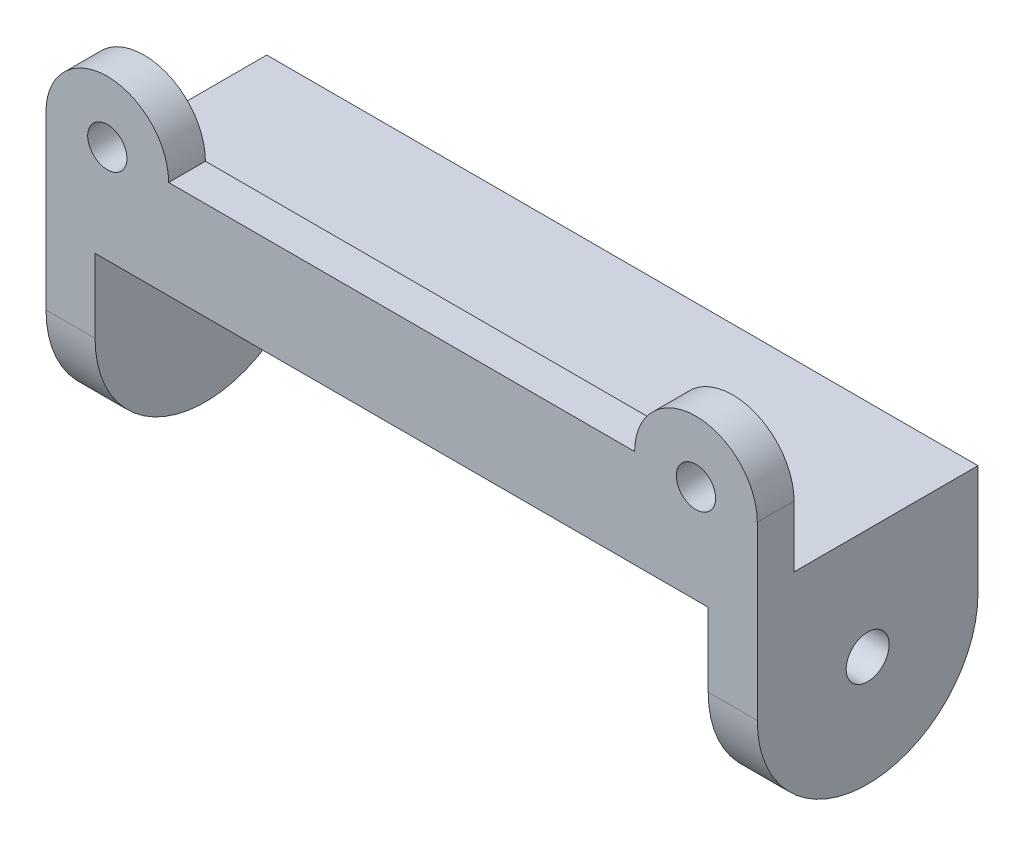
ISO-10303-21;
HEADER;
FILE_DESCRIPTION(('STEP AP214'),'2;1');
FILE_NAME('part.step','',(''),(''),'','','');
FILE_SCHEMA(('AUTOMOTIVE_DESIGN { 1 0 10303 214 1 1 1 1 }'));
ENDSEC;
DATA;
#1=APPLICATION_CONTEXT('core data for automotive mechanical design processes');
#2=APPLICATION_PROTOCOL_DEFINITION('international standard','automotive_design',2000,#1);
#3=PRODUCT_CONTEXT('',#1,'mechanical');
#4=PRODUCT('Part','Part','',(#3));
#5=PRODUCT_RELATED_PRODUCT_CATEGORY('part','',(#4));
#6=PRODUCT_DEFINITION_FORMATION('','',#4);
#7=PRODUCT_DEFINITION_CONTEXT('part definition',#1,'design');
#8=PRODUCT_DEFINITION('design','',#6,#7);
#9=PRODUCT_DEFINITION_SHAPE('','',#8);
#10=(LENGTH_UNIT() NAMED_UNIT(*) SI_UNIT(.MILLI.,.METRE.));
#11=(NAMED_UNIT(*) PLANE_ANGLE_UNIT() SI_UNIT($,.RADIAN.));
#12=(NAMED_UNIT(*) SI_UNIT($,.STERADIAN.) SOLID_ANGLE_UNIT());
#13=UNCERTAINTY_MEASURE_WITH_UNIT(LENGTH_MEASURE(1.E-05),#10,'distance_accuracy_value','');
#14=(GEOMETRIC_REPRESENTATION_CONTEXT(3) GLOBAL_UNCERTAINTY_ASSIGNED_CONTEXT((#13)) GLOBAL_UNIT_ASSIGNED_CONTEXT((#10,
#11,#12)) REPRESENTATION_CONTEXT('',''));
#15=CARTESIAN_POINT('',(0.,0.,0.));
#16=DIRECTION('',(0.,0.,1.));
#17=DIRECTION('',(1.,0.,0.));
#18=AXIS2_PLACEMENT_3D('',#15,#16,#17);
#19=CARTESIAN_POINT('',(-29.,-8.,-15.));
#20=DIRECTION('',(0.,-1.,0.));
#21=DIRECTION('',(0.,0.,-1.));
#22=AXIS2_PLACEMENT_3D('',#19,#20,#21);
#23=PLANE('',#22);
#24=DIRECTION('',(0.,0.,1.));
#25=VECTOR('',#24,1.);
#26=CARTESIAN_POINT('',(25.,-8.,3.));
#27=LINE('',#26,#25);
#28=CARTESIAN_POINT('',(25.,-8.,-15.));
#29=VERTEX_POINT('',#28);
#30=CARTESIAN_POINT('',(25.,-8.,-11.2915026221292));
#31=VERTEX_POINT('',#30);
#32=EDGE_CURVE('E152',#29,#31,#27,.T.);
#33=ORIENTED_EDGE('',*,*,#32,.T.);
#34=DIRECTION('',(1.,0.,0.));
#35=VECTOR('',#34,1.);
#36=CARTESIAN_POINT('',(-47.6274169979695,-8.,-11.2915026221292));
#37=LINE('',#36,#35);
#38=CARTESIAN_POINT('',(-25.,-8.,-11.2915026221292));
#39=VERTEX_POINT('',#38);
#40=EDGE_CURVE('E139',#31,#39,#37,.F.);
#41=ORIENTED_EDGE('',*,*,#40,.T.);
#42=DIRECTION('',(0.,0.,1.));
#43=VECTOR('',#42,1.);
#44=CARTESIAN_POINT('',(-25.,-8.,3.));
#45=LINE('',#44,#43);
#46=CARTESIAN_POINT('',(-25.,-8.,-15.));
#47=VERTEX_POINT('',#46);
#48=EDGE_CURVE('E149',#47,#39,#45,.T.);
#49=ORIENTED_EDGE('',*,*,#48,.F.);
#50=DIRECTION('',(1.,0.,0.));
#51=VECTOR('',#50,1.);
#52=CARTESIAN_POINT('',(-29.,-8.,-15.));
#53=LINE('',#52,#51);
#54=EDGE_CURVE('E226',#47,#29,#53,.T.);
#55=ORIENTED_EDGE('',*,*,#54,.T.);
#56=EDGE_LOOP('',(#33,#41,#49,#55));
#57=FACE_BOUND('',#56,.T.);
#58=ADVANCED_FACE('F38',(#57),#23,.T.);
#59=CARTESIAN_POINT('',(-25.,-8.,-0.708497377870822));
#60=VERTEX_POINT('',#59);
#61=CARTESIAN_POINT('',(-25.,-8.,3.));
#62=VERTEX_POINT('',#61);
#63=EDGE_CURVE('E59',#60,#62,#45,.T.);
#64=ORIENTED_EDGE('',*,*,#63,.F.);
#65=DIRECTION('',(1.,0.,0.));
#66=VECTOR('',#65,1.);
#67=CARTESIAN_POINT('',(-47.6274169979695,-8.,-0.708497377870822));
#68=LINE('',#67,#66);
#69=CARTESIAN_POINT('',(25.,-8.,-0.708497377870822));
#70=VERTEX_POINT('',#69);
#71=EDGE_CURVE('E142',#60,#70,#68,.T.);
#72=ORIENTED_EDGE('',*,*,#71,.T.);
#73=CARTESIAN_POINT('',(25.,-8.,3.));
#74=VERTEX_POINT('',#73);
#75=EDGE_CURVE('E199',#70,#74,#27,.T.);
#76=ORIENTED_EDGE('',*,*,#75,.T.);
#77=DIRECTION('',(1.,0.,0.));
#78=VECTOR('',#77,1.);
#79=CARTESIAN_POINT('',(-29.,-8.,3.));
#80=LINE('',#79,#78);
#81=EDGE_CURVE('E219',#62,#74,#80,.T.);
#82=ORIENTED_EDGE('',*,*,#81,.F.);
#83=EDGE_LOOP('',(#64,#72,#76,#82));
#84=FACE_BOUND('',#83,.T.);
#85=ADVANCED_FACE('F383',(#84),#23,.T.);
#86=CARTESIAN_POINT('',(-24.,0.,3.));
#87=DIRECTION('',(0.,0.,1.));
#88=DIRECTION('',(1.,0.,0.));
#89=AXIS2_PLACEMENT_3D('',#86,#87,#88);
#90=PLANE('',#89);
#91=CARTESIAN_POINT('',(-24.,0.,3.));
#92=DIRECTION('',(0.,0.,1.));
#93=DIRECTION('',(1.,0.,0.));
#94=AXIS2_PLACEMENT_3D('',#91,#92,#93);
#95=CIRCLE('',#94,1.6);
#96=CARTESIAN_POINT('',(-22.4,0.,3.));
#97=VERTEX_POINT('',#96);
#98=EDGE_CURVE('E257',#97,#97,#95,.T.);
#99=ORIENTED_EDGE('',*,*,#98,.F.);
#100=EDGE_LOOP('',(#99));
#101=FACE_BOUND('',#100,.T.);
#102=CARTESIAN_POINT('',(-24.,0.,3.));
#103=DIRECTION('',(0.,0.,1.));
#104=DIRECTION('',(1.,0.,0.));
#105=AXIS2_PLACEMENT_3D('',#102,#103,#104);
#106=CIRCLE('',#105,5.);
#107=CARTESIAN_POINT('',(-19.,0.,3.));
#108=VERTEX_POINT('',#107);
#109=CARTESIAN_POINT('',(-29.,0.,3.));
#110=VERTEX_POINT('',#109);
#111=EDGE_CURVE('E265',#108,#110,#106,.T.);
#112=ORIENTED_EDGE('',*,*,#111,.T.);
#113=DIRECTION('',(0.,-1.,0.));
#114=VECTOR('',#113,1.);
#115=CARTESIAN_POINT('',(-29.,0.,3.));
#116=LINE('',#115,#114);
#117=CARTESIAN_POINT('',(-29.,-14.,3.));
#118=VERTEX_POINT('',#117);
#119=EDGE_CURVE('E269',#110,#118,#116,.T.);
#120=ORIENTED_EDGE('',*,*,#119,.T.);
#121=DIRECTION('',(-1.,0.,0.));
#122=VECTOR('',#121,1.);
#123=CARTESIAN_POINT('',(-25.,-14.,3.));
#124=LINE('',#123,#122);
#125=CARTESIAN_POINT('',(-25.,-14.,3.));
#126=VERTEX_POINT('',#125);
#127=EDGE_CURVE('E180',#126,#118,#124,.T.);
#128=ORIENTED_EDGE('',*,*,#127,.F.);
#129=DIRECTION('',(0.,-1.,0.));
#130=VECTOR('',#129,1.);
#131=CARTESIAN_POINT('',(-25.,-8.,3.));
#132=LINE('',#131,#130);
#133=EDGE_CURVE('E172',#62,#126,#132,.T.);
#134=ORIENTED_EDGE('',*,*,#133,.F.);
#135=ORIENTED_EDGE('',*,*,#81,.T.);
#136=DIRECTION('',(0.,-1.,0.));
#137=VECTOR('',#136,1.);
#138=CARTESIAN_POINT('',(25.,-8.,3.));
#139=LINE('',#138,#137);
#140=CARTESIAN_POINT('',(25.,-14.,3.));
#141=VERTEX_POINT('',#140);
#142=EDGE_CURVE('E198',#74,#141,#139,.T.);
#143=ORIENTED_EDGE('',*,*,#142,.T.);
#144=DIRECTION('',(1.,0.,0.));
#145=VECTOR('',#144,1.);
#146=CARTESIAN_POINT('',(25.,-14.,3.));
#147=LINE('',#146,#145);
#148=CARTESIAN_POINT('',(29.,-14.,3.));
#149=VERTEX_POINT('',#148);
#150=EDGE_CURVE('E211',#141,#149,#147,.T.);
#151=ORIENTED_EDGE('',*,*,#150,.T.);
#152=DIRECTION('',(0.,1.,0.));
#153=VECTOR('',#152,1.);
#154=CARTESIAN_POINT('',(29.,-4.99999999999999,3.));
#155=LINE('',#154,#153);
#156=CARTESIAN_POINT('',(29.,0.,3.));
#157=VERTEX_POINT('',#156);
#158=EDGE_CURVE('E273',#149,#157,#155,.T.);
#159=ORIENTED_EDGE('',*,*,#158,.T.);
#160=CARTESIAN_POINT('',(24.,0.,3.));
#161=DIRECTION('',(0.,0.,1.));
#162=DIRECTION('',(1.,0.,0.));
#163=AXIS2_PLACEMENT_3D('',#160,#161,#162);
#164=CIRCLE('',#163,5.);
#165=CARTESIAN_POINT('',(19.,0.,3.));
#166=VERTEX_POINT('',#165);
#167=EDGE_CURVE('E276',#157,#166,#164,.T.);
#168=ORIENTED_EDGE('',*,*,#167,.T.);
#169=DIRECTION('',(-1.,0.,0.));
#170=VECTOR('',#169,1.);
#171=CARTESIAN_POINT('',(-19.,0.,3.));
#172=LINE('',#171,#170);
#173=EDGE_CURVE('E279',#166,#108,#172,.T.);
#174=ORIENTED_EDGE('',*,*,#173,.T.);
#175=EDGE_LOOP('',(#112,#120,#128,#134,#135,#143,#151,#159,#168,#174));
#176=FACE_BOUND('',#175,.T.);
#177=CARTESIAN_POINT('',(24.,0.,3.));
#178=DIRECTION('',(0.,0.,1.));
#179=DIRECTION('',(1.,0.,0.));
#180=AXIS2_PLACEMENT_3D('',#177,#178,#179);
#181=CIRCLE('',#180,1.6);
#182=CARTESIAN_POINT('',(25.6,0.,3.));
#183=VERTEX_POINT('',#182);
#184=EDGE_CURVE('E249',#183,#183,#181,.T.);
#185=ORIENTED_EDGE('',*,*,#184,.F.);
#186=EDGE_LOOP('',(#185));
#187=FACE_BOUND('',#186,.T.);
#188=ADVANCED_FACE('F330',(#101,#176,#187),#90,.T.);
#189=CARTESIAN_POINT('',(-24.,0.,0.));
#190=DIRECTION('',(0.,0.,1.));
#191=DIRECTION('',(1.,0.,0.));
#192=AXIS2_PLACEMENT_3D('',#189,#190,#191);
#193=PLANE('',#192);
#194=CARTESIAN_POINT('',(-24.,0.,0.));
#195=DIRECTION('',(0.,0.,1.));
#196=DIRECTION('',(1.,0.,0.));
#197=AXIS2_PLACEMENT_3D('',#194,#195,#196);
#198=CIRCLE('',#197,5.);
#199=CARTESIAN_POINT('',(-19.,0.,0.));
#200=VERTEX_POINT('',#199);
#201=CARTESIAN_POINT('',(-29.,0.,0.));
#202=VERTEX_POINT('',#201);
#203=EDGE_CURVE('E261',#200,#202,#198,.T.);
#204=ORIENTED_EDGE('',*,*,#203,.F.);
#205=DIRECTION('',(-1.,0.,0.));
#206=VECTOR('',#205,1.);
#207=CARTESIAN_POINT('',(-19.,0.,0.));
#208=LINE('',#207,#206);
#209=CARTESIAN_POINT('',(19.,0.,0.));
#210=VERTEX_POINT('',#209);
#211=EDGE_CURVE('E270',#210,#200,#208,.T.);
#212=ORIENTED_EDGE('',*,*,#211,.F.);
#213=CARTESIAN_POINT('',(24.,0.,0.));
#214=DIRECTION('',(0.,0.,1.));
#215=DIRECTION('',(1.,0.,0.));
#216=AXIS2_PLACEMENT_3D('',#213,#214,#215);
#217=CIRCLE('',#216,5.);
#218=CARTESIAN_POINT('',(29.,0.,0.));
#219=VERTEX_POINT('',#218);
#220=EDGE_CURVE('E296',#219,#210,#217,.T.);
#221=ORIENTED_EDGE('',*,*,#220,.F.);
#222=DIRECTION('',(0.,1.,0.));
#223=VECTOR('',#222,1.);
#224=CARTESIAN_POINT('',(29.,-4.99999999999999,0.));
#225=LINE('',#224,#223);
#226=CARTESIAN_POINT('',(29.,-5.,0.));
#227=VERTEX_POINT('',#226);
#228=EDGE_CURVE('E293',#227,#219,#225,.T.);
#229=ORIENTED_EDGE('',*,*,#228,.F.);
#230=DIRECTION('',(1.,0.,0.));
#231=VECTOR('',#230,1.);
#232=CARTESIAN_POINT('',(-29.,-5.,0.));
#233=LINE('',#232,#231);
#234=CARTESIAN_POINT('',(-29.,-5.,0.));
#235=VERTEX_POINT('',#234);
#236=EDGE_CURVE('E289',#235,#227,#233,.T.);
#237=ORIENTED_EDGE('',*,*,#236,.F.);
#238=DIRECTION('',(0.,-1.,0.));
#239=VECTOR('',#238,1.);
#240=CARTESIAN_POINT('',(-29.,0.,0.));
#241=LINE('',#240,#239);
#242=EDGE_CURVE('E286',#202,#235,#241,.T.);
#243=ORIENTED_EDGE('',*,*,#242,.F.);
#244=EDGE_LOOP('',(#204,#212,#221,#229,#237,#243));
#245=FACE_BOUND('',#244,.T.);
#246=CARTESIAN_POINT('',(-24.,0.,0.));
#247=DIRECTION('',(0.,0.,1.));
#248=DIRECTION('',(1.,0.,0.));
#249=AXIS2_PLACEMENT_3D('',#246,#247,#248);
#250=CIRCLE('',#249,1.6);
#251=CARTESIAN_POINT('',(-22.4,0.,0.));
#252=VERTEX_POINT('',#251);
#253=EDGE_CURVE('E253',#252,#252,#250,.T.);
#254=ORIENTED_EDGE('',*,*,#253,.T.);
#255=EDGE_LOOP('',(#254));
#256=FACE_BOUND('',#255,.T.);
#257=CARTESIAN_POINT('',(24.,0.,0.));
#258=DIRECTION('',(0.,0.,1.));
#259=DIRECTION('',(1.,0.,0.));
#260=AXIS2_PLACEMENT_3D('',#257,#258,#259);
#261=CIRCLE('',#260,1.6);
#262=CARTESIAN_POINT('',(25.6,0.,0.));
#263=VERTEX_POINT('',#262);
#264=EDGE_CURVE('E245',#263,#263,#261,.T.);
#265=ORIENTED_EDGE('',*,*,#264,.T.);
#266=EDGE_LOOP('',(#265));
#267=FACE_BOUND('',#266,.T.);
#268=ADVANCED_FACE('F319',(#245,#256,#267),#193,.F.);
#269=CARTESIAN_POINT('',(-24.,0.,3.));
#270=DIRECTION('',(0.,0.,-1.));
#271=DIRECTION('',(-1.,0.,0.));
#272=AXIS2_PLACEMENT_3D('',#269,#270,#271);
#273=CYLINDRICAL_SURFACE('',#272,5.);
#274=ORIENTED_EDGE('',*,*,#203,.T.);
#275=DIRECTION('',(0.,0.,-1.));
#276=VECTOR('',#275,1.);
#277=CARTESIAN_POINT('',(-29.,0.,3.));
#278=LINE('',#277,#276);
#279=EDGE_CURVE('E11',#110,#202,#278,.T.);
#280=ORIENTED_EDGE('',*,*,#279,.F.);
#281=ORIENTED_EDGE('',*,*,#111,.F.);
#282=DIRECTION('',(0.,0.,-1.));
#283=VECTOR('',#282,1.);
#284=CARTESIAN_POINT('',(-19.,0.,3.));
#285=LINE('',#284,#283);
#286=EDGE_CURVE('E282',#108,#200,#285,.T.);
#287=ORIENTED_EDGE('',*,*,#286,.T.);
#288=EDGE_LOOP('',(#274,#280,#281,#287));
#289=FACE_BOUND('',#288,.T.);
#290=ADVANCED_FACE('F40',(#289),#273,.T.);
#291=CARTESIAN_POINT('',(-29.,0.,3.));
#292=DIRECTION('',(1.,0.,0.));
#293=DIRECTION('',(0.,0.,-1.));
#294=AXIS2_PLACEMENT_3D('',#291,#292,#293);
#295=PLANE('',#294);
#296=ORIENTED_EDGE('',*,*,#242,.T.);
#297=DIRECTION('',(0.,0.,1.));
#298=VECTOR('',#297,1.);
#299=CARTESIAN_POINT('',(-29.,-5.,-15.));
#300=LINE('',#299,#298);
#301=CARTESIAN_POINT('',(-29.,-5.,-15.));
#302=VERTEX_POINT('',#301);
#303=EDGE_CURVE('E241',#302,#235,#300,.T.);
#304=ORIENTED_EDGE('',*,*,#303,.F.);
#305=DIRECTION('',(0.,-1.,0.));
#306=VECTOR('',#305,1.);
#307=CARTESIAN_POINT('',(-29.,-5.,-15.));
#308=LINE('',#307,#306);
#309=CARTESIAN_POINT('',(-29.,-14.,-15.));
#310=VERTEX_POINT('',#309);
#311=EDGE_CURVE('E223',#302,#310,#308,.T.);
#312=ORIENTED_EDGE('',*,*,#311,.T.);
#313=CARTESIAN_POINT('',(-29.,-14.,-6.));
#314=DIRECTION('',(1.,0.,0.));
#315=DIRECTION('',(0.,0.,-1.));
#316=AXIS2_PLACEMENT_3D('',#313,#314,#315);
#317=CIRCLE('',#316,9.);
#318=EDGE_CURVE('E166',#118,#310,#317,.T.);
#319=ORIENTED_EDGE('',*,*,#318,.F.);
#320=ORIENTED_EDGE('',*,*,#119,.F.);
#321=ORIENTED_EDGE('',*,*,#279,.T.);
#322=EDGE_LOOP('',(#296,#304,#312,#319,#320,#321));
#323=FACE_BOUND('',#322,.T.);
#324=CARTESIAN_POINT('',(-29.,-14.,-6.));
#325=DIRECTION('',(1.,0.,0.));
#326=DIRECTION('',(0.,0.,-1.));
#327=AXIS2_PLACEMENT_3D('',#324,#325,#326);
#328=CIRCLE('',#327,1.75);
#329=CARTESIAN_POINT('',(-29.,-14.,-7.75));
#330=VERTEX_POINT('',#329);
#331=EDGE_CURVE('E154',#330,#330,#328,.T.);
#332=ORIENTED_EDGE('',*,*,#331,.T.);
#333=EDGE_LOOP('',(#332));
#334=FACE_BOUND('',#333,.T.);
#335=ADVANCED_FACE('F347',(#323,#334),#295,.F.);
#336=CARTESIAN_POINT('',(29.,-4.99999999999999,3.));
#337=DIRECTION('',(-1.,0.,0.));
#338=DIRECTION('',(0.,0.,1.));
#339=AXIS2_PLACEMENT_3D('',#336,#337,#338);
#340=PLANE('',#339);
#341=ORIENTED_EDGE('',*,*,#228,.T.);
#342=DIRECTION('',(0.,0.,-1.));
#343=VECTOR('',#342,1.);
#344=CARTESIAN_POINT('',(29.,0.,3.));
#345=LINE('',#344,#343);
#346=EDGE_CURVE('E47',#157,#219,#345,.T.);
#347=ORIENTED_EDGE('',*,*,#346,.F.);
#348=ORIENTED_EDGE('',*,*,#158,.F.);
#349=CARTESIAN_POINT('',(29.,-14.,-6.));
#350=DIRECTION('',(1.,0.,0.));
#351=DIRECTION('',(0.,0.,-1.));
#352=AXIS2_PLACEMENT_3D('',#349,#350,#351);
#353=CIRCLE('',#352,9.);
#354=CARTESIAN_POINT('',(29.,-14.,-15.));
#355=VERTEX_POINT('',#354);
#356=EDGE_CURVE('E192',#149,#355,#353,.T.);
#357=ORIENTED_EDGE('',*,*,#356,.T.);
#358=DIRECTION('',(0.,1.,0.));
#359=VECTOR('',#358,1.);
#360=CARTESIAN_POINT('',(29.,-5.,-15.));
#361=LINE('',#360,#359);
#362=CARTESIAN_POINT('',(29.,-5.,-15.));
#363=VERTEX_POINT('',#362);
#364=EDGE_CURVE('E229',#355,#363,#361,.T.);
#365=ORIENTED_EDGE('',*,*,#364,.T.);
#366=DIRECTION('',(0.,0.,1.));
#367=VECTOR('',#366,1.);
#368=CARTESIAN_POINT('',(29.,-5.,-15.));
#369=LINE('',#368,#367);
#370=EDGE_CURVE('E237',#363,#227,#369,.T.);
#371=ORIENTED_EDGE('',*,*,#370,.T.);
#372=EDGE_LOOP('',(#341,#347,#348,#357,#365,#371));
#373=FACE_BOUND('',#372,.T.);
#374=CARTESIAN_POINT('',(29.,-14.,-6.));
#375=DIRECTION('',(1.,0.,0.));
#376=DIRECTION('',(0.,0.,-1.));
#377=AXIS2_PLACEMENT_3D('',#374,#375,#376);
#378=CIRCLE('',#377,1.75);
#379=CARTESIAN_POINT('',(29.,-14.,-7.75));
#380=VERTEX_POINT('',#379);
#381=EDGE_CURVE('E184',#380,#380,#378,.T.);
#382=ORIENTED_EDGE('',*,*,#381,.F.);
#383=EDGE_LOOP('',(#382));
#384=FACE_BOUND('',#383,.T.);
#385=ADVANCED_FACE('F334',(#373,#384),#340,.F.);
#386=CARTESIAN_POINT('',(24.,0.,3.));
#387=DIRECTION('',(0.,0.,-1.));
#388=DIRECTION('',(-1.,0.,0.));
#389=AXIS2_PLACEMENT_3D('',#386,#387,#388);
#390=CYLINDRICAL_SURFACE('',#389,5.);
#391=ORIENTED_EDGE('',*,*,#220,.T.);
#392=DIRECTION('',(0.,0.,-1.));
#393=VECTOR('',#392,1.);
#394=CARTESIAN_POINT('',(19.,0.,3.));
#395=LINE('',#394,#393);
#396=EDGE_CURVE('E304',#166,#210,#395,.T.);
#397=ORIENTED_EDGE('',*,*,#396,.F.);
#398=ORIENTED_EDGE('',*,*,#167,.F.);
#399=ORIENTED_EDGE('',*,*,#346,.T.);
#400=EDGE_LOOP('',(#391,#397,#398,#399));
#401=FACE_BOUND('',#400,.T.);
#402=ADVANCED_FACE('F313',(#401),#390,.T.);
#403=CARTESIAN_POINT('',(-19.,0.,3.));
#404=DIRECTION('',(0.,-1.,0.));
#405=DIRECTION('',(1.,0.,0.));
#406=AXIS2_PLACEMENT_3D('',#403,#404,#405);
#407=PLANE('',#406);
#408=ORIENTED_EDGE('',*,*,#211,.T.);
#409=ORIENTED_EDGE('',*,*,#286,.F.);
#410=ORIENTED_EDGE('',*,*,#173,.F.);
#411=ORIENTED_EDGE('',*,*,#396,.T.);
#412=EDGE_LOOP('',(#408,#409,#410,#411));
#413=FACE_BOUND('',#412,.T.);
#414=ADVANCED_FACE('F324',(#413),#407,.F.);
#415=CARTESIAN_POINT('',(-24.,0.,3.));
#416=DIRECTION('',(0.,0.,-1.));
#417=DIRECTION('',(-1.,0.,0.));
#418=AXIS2_PLACEMENT_3D('',#415,#416,#417);
#419=CYLINDRICAL_SURFACE('',#418,1.6);
#420=ORIENTED_EDGE('',*,*,#98,.T.);
#421=EDGE_LOOP('',(#420));
#422=FACE_BOUND('',#421,.T.);
#423=ORIENTED_EDGE('',*,*,#253,.F.);
#424=EDGE_LOOP('',(#423));
#425=FACE_BOUND('',#424,.T.);
#426=ADVANCED_FACE('F395',(#422,#425),#419,.F.);
#427=CARTESIAN_POINT('',(24.,0.,3.));
#428=DIRECTION('',(0.,0.,-1.));
#429=DIRECTION('',(-1.,0.,0.));
#430=AXIS2_PLACEMENT_3D('',#427,#428,#429);
#431=CYLINDRICAL_SURFACE('',#430,1.6);
#432=ORIENTED_EDGE('',*,*,#184,.T.);
#433=EDGE_LOOP('',(#432));
#434=FACE_BOUND('',#433,.T.);
#435=ORIENTED_EDGE('',*,*,#264,.F.);
#436=EDGE_LOOP('',(#435));
#437=FACE_BOUND('',#436,.T.);
#438=ADVANCED_FACE('F392',(#434,#437),#431,.F.);
#439=CARTESIAN_POINT('',(-29.,-5.,-15.));
#440=DIRECTION('',(0.,1.,0.));
#441=DIRECTION('',(0.,0.,1.));
#442=AXIS2_PLACEMENT_3D('',#439,#440,#441);
#443=PLANE('',#442);
#444=ORIENTED_EDGE('',*,*,#303,.T.);
#445=ORIENTED_EDGE('',*,*,#236,.T.);
#446=ORIENTED_EDGE('',*,*,#370,.F.);
#447=DIRECTION('',(-1.,0.,0.));
#448=VECTOR('',#447,1.);
#449=CARTESIAN_POINT('',(-29.,-5.,-15.));
#450=LINE('',#449,#448);
#451=EDGE_CURVE('E233',#363,#302,#450,.T.);
#452=ORIENTED_EDGE('',*,*,#451,.T.);
#453=EDGE_LOOP('',(#444,#445,#446,#452));
#454=FACE_BOUND('',#453,.T.);
#455=ADVANCED_FACE('F345',(#454),#443,.T.);
#456=CARTESIAN_POINT('',(0.,0.,-15.));
#457=DIRECTION('',(0.,0.,1.));
#458=DIRECTION('',(1.,0.,0.));
#459=AXIS2_PLACEMENT_3D('',#456,#457,#458);
#460=PLANE('',#459);
#461=ORIENTED_EDGE('',*,*,#311,.F.);
#462=ORIENTED_EDGE('',*,*,#451,.F.);
#463=ORIENTED_EDGE('',*,*,#364,.F.);
#464=DIRECTION('',(1.,0.,0.));
#465=VECTOR('',#464,1.);
#466=CARTESIAN_POINT('',(25.,-14.,-15.));
#467=LINE('',#466,#465);
#468=CARTESIAN_POINT('',(25.,-14.,-15.));
#469=VERTEX_POINT('',#468);
#470=EDGE_CURVE('E215',#469,#355,#467,.T.);
#471=ORIENTED_EDGE('',*,*,#470,.F.);
#472=DIRECTION('',(0.,1.,0.));
#473=VECTOR('',#472,1.);
#474=CARTESIAN_POINT('',(25.,-8.,-15.));
#475=LINE('',#474,#473);
#476=EDGE_CURVE('E207',#469,#29,#475,.T.);
#477=ORIENTED_EDGE('',*,*,#476,.T.);
#478=ORIENTED_EDGE('',*,*,#54,.F.);
#479=DIRECTION('',(0.,1.,0.));
#480=VECTOR('',#479,1.);
#481=CARTESIAN_POINT('',(-25.,-8.,-15.));
#482=LINE('',#481,#480);
#483=CARTESIAN_POINT('',(-25.,-14.,-15.));
#484=VERTEX_POINT('',#483);
#485=EDGE_CURVE('E159',#484,#47,#482,.T.);
#486=ORIENTED_EDGE('',*,*,#485,.F.);
#487=DIRECTION('',(-1.,0.,0.));
#488=VECTOR('',#487,1.);
#489=CARTESIAN_POINT('',(-25.,-14.,-15.));
#490=LINE('',#489,#488);
#491=EDGE_CURVE('E175',#484,#310,#490,.T.);
#492=ORIENTED_EDGE('',*,*,#491,.T.);
#493=EDGE_LOOP('',(#461,#462,#463,#471,#477,#478,#486,#492));
#494=FACE_BOUND('',#493,.T.);
#495=ADVANCED_FACE('F343',(#494),#460,.F.);
#496=CARTESIAN_POINT('',(25.,-14.,-6.));
#497=DIRECTION('',(1.,0.,0.));
#498=DIRECTION('',(0.,0.,-1.));
#499=AXIS2_PLACEMENT_3D('',#496,#497,#498);
#500=CYLINDRICAL_SURFACE('',#499,9.);
#501=ORIENTED_EDGE('',*,*,#356,.F.);
#502=ORIENTED_EDGE('',*,*,#150,.F.);
#503=CARTESIAN_POINT('',(25.,-14.,-6.));
#504=DIRECTION('',(1.,0.,0.));
#505=DIRECTION('',(0.,0.,-1.));
#506=AXIS2_PLACEMENT_3D('',#503,#504,#505);
#507=CIRCLE('',#506,9.);
#508=EDGE_CURVE('E203',#141,#469,#507,.T.);
#509=ORIENTED_EDGE('',*,*,#508,.T.);
#510=ORIENTED_EDGE('',*,*,#470,.T.);
#511=EDGE_LOOP('',(#501,#502,#509,#510));
#512=FACE_BOUND('',#511,.T.);
#513=ADVANCED_FACE('F338',(#512),#500,.T.);
#514=CARTESIAN_POINT('',(25.,-14.,-6.));
#515=DIRECTION('',(1.,0.,0.));
#516=DIRECTION('',(0.,0.,-1.));
#517=AXIS2_PLACEMENT_3D('',#514,#515,#516);
#518=PLANE('',#517);
#519=ORIENTED_EDGE('',*,*,#75,.F.);
#520=CARTESIAN_POINT('',(25.,-14.,-6.));
#521=DIRECTION('',(-1.,0.,0.));
#522=DIRECTION('',(0.,0.,1.));
#523=AXIS2_PLACEMENT_3D('',#520,#521,#522);
#524=CIRCLE('',#523,8.);
#525=EDGE_CURVE('E144',#70,#31,#524,.T.);
#526=ORIENTED_EDGE('',*,*,#525,.T.);
#527=ORIENTED_EDGE('',*,*,#32,.F.);
#528=ORIENTED_EDGE('',*,*,#476,.F.);
#529=ORIENTED_EDGE('',*,*,#508,.F.);
#530=ORIENTED_EDGE('',*,*,#142,.F.);
#531=EDGE_LOOP('',(#519,#526,#527,#528,#529,#530));
#532=FACE_BOUND('',#531,.T.);
#533=CARTESIAN_POINT('',(25.,-14.,-6.));
#534=DIRECTION('',(1.,0.,0.));
#535=DIRECTION('',(0.,0.,-1.));
#536=AXIS2_PLACEMENT_3D('',#533,#534,#535);
#537=CIRCLE('',#536,1.75);
#538=CARTESIAN_POINT('',(25.,-14.,-7.75));
#539=VERTEX_POINT('',#538);
#540=EDGE_CURVE('E188',#539,#539,#537,.T.);
#541=ORIENTED_EDGE('',*,*,#540,.T.);
#542=EDGE_LOOP('',(#541));
#543=FACE_BOUND('',#542,.T.);
#544=ADVANCED_FACE('F356',(#532,#543),#518,.F.);
#545=CARTESIAN_POINT('',(25.,-14.,-6.));
#546=DIRECTION('',(1.,0.,0.));
#547=DIRECTION('',(0.,0.,-1.));
#548=AXIS2_PLACEMENT_3D('',#545,#546,#547);
#549=CYLINDRICAL_SURFACE('',#548,1.75);
#550=ORIENTED_EDGE('',*,*,#540,.F.);
#551=EDGE_LOOP('',(#550));
#552=FACE_BOUND('',#551,.T.);
#553=ORIENTED_EDGE('',*,*,#381,.T.);
#554=EDGE_LOOP('',(#553));
#555=FACE_BOUND('',#554,.T.);
#556=ADVANCED_FACE('F435',(#552,#555),#549,.F.);
#557=CARTESIAN_POINT('',(-25.,-14.,-6.));
#558=DIRECTION('',(-1.,0.,0.));
#559=DIRECTION('',(0.,0.,-1.));
#560=AXIS2_PLACEMENT_3D('',#557,#558,#559);
#561=PLANE('',#560);
#562=ORIENTED_EDGE('',*,*,#48,.T.);
#563=CARTESIAN_POINT('',(-25.,-14.,-6.));
#564=DIRECTION('',(-1.,0.,0.));
#565=DIRECTION('',(0.,0.,1.));
#566=AXIS2_PLACEMENT_3D('',#563,#564,#565);
#567=CIRCLE('',#566,8.);
#568=EDGE_CURVE('E54',#60,#39,#567,.T.);
#569=ORIENTED_EDGE('',*,*,#568,.F.);
#570=ORIENTED_EDGE('',*,*,#63,.T.);
#571=ORIENTED_EDGE('',*,*,#133,.T.);
#572=CARTESIAN_POINT('',(-25.,-14.,-6.));
#573=DIRECTION('',(1.,0.,0.));
#574=DIRECTION('',(0.,0.,-1.));
#575=AXIS2_PLACEMENT_3D('',#572,#573,#574);
#576=CIRCLE('',#575,9.);
#577=EDGE_CURVE('E164',#126,#484,#576,.T.);
#578=ORIENTED_EDGE('',*,*,#577,.T.);
#579=ORIENTED_EDGE('',*,*,#485,.T.);
#580=EDGE_LOOP('',(#562,#569,#570,#571,#578,#579));
#581=FACE_BOUND('',#580,.T.);
#582=CARTESIAN_POINT('',(-25.,-14.,-6.));
#583=DIRECTION('',(1.,0.,0.));
#584=DIRECTION('',(0.,0.,-1.));
#585=AXIS2_PLACEMENT_3D('',#582,#583,#584);
#586=CIRCLE('',#585,1.75);
#587=CARTESIAN_POINT('',(-25.,-14.,-7.75));
#588=VERTEX_POINT('',#587);
#589=EDGE_CURVE('E179',#588,#588,#586,.T.);
#590=ORIENTED_EDGE('',*,*,#589,.F.);
#591=EDGE_LOOP('',(#590));
#592=FACE_BOUND('',#591,.T.);
#593=ADVANCED_FACE('F156',(#581,#592),#561,.F.);
#594=CARTESIAN_POINT('',(-25.,-14.,-6.));
#595=DIRECTION('',(-1.,0.,0.));
#596=DIRECTION('',(0.,0.,1.));
#597=AXIS2_PLACEMENT_3D('',#594,#595,#596);
#598=CYLINDRICAL_SURFACE('',#597,9.);
#599=ORIENTED_EDGE('',*,*,#318,.T.);
#600=ORIENTED_EDGE('',*,*,#491,.F.);
#601=ORIENTED_EDGE('',*,*,#577,.F.);
#602=ORIENTED_EDGE('',*,*,#127,.T.);
#603=EDGE_LOOP('',(#599,#600,#601,#602));
#604=FACE_BOUND('',#603,.T.);
#605=ADVANCED_FACE('F352',(#604),#598,.T.);
#606=CARTESIAN_POINT('',(-25.,-14.,-6.));
#607=DIRECTION('',(-1.,0.,0.));
#608=DIRECTION('',(0.,0.,1.));
#609=AXIS2_PLACEMENT_3D('',#606,#607,#608);
#610=CYLINDRICAL_SURFACE('',#609,1.75);
#611=ORIENTED_EDGE('',*,*,#589,.T.);
#612=EDGE_LOOP('',(#611));
#613=FACE_BOUND('',#612,.T.);
#614=ORIENTED_EDGE('',*,*,#331,.F.);
#615=EDGE_LOOP('',(#614));
#616=FACE_BOUND('',#615,.T.);
#617=ADVANCED_FACE('F371',(#613,#616),#610,.F.);
#618=CARTESIAN_POINT('',(-47.6274169979695,-14.,-6.));
#619=DIRECTION('',(1.,0.,0.));
#620=DIRECTION('',(0.,0.,-1.));
#621=AXIS2_PLACEMENT_3D('',#618,#619,#620);
#622=CYLINDRICAL_SURFACE('',#621,8.);
#623=ORIENTED_EDGE('',*,*,#525,.F.);
#624=ORIENTED_EDGE('',*,*,#71,.F.);
#625=ORIENTED_EDGE('',*,*,#568,.T.);
#626=ORIENTED_EDGE('',*,*,#40,.F.);
#627=EDGE_LOOP('',(#623,#624,#625,#626));
#628=FACE_BOUND('',#627,.T.);
#629=ADVANCED_FACE('F138',(#628),#622,.F.);
#630=CLOSED_SHELL('',(#58,#85,#188,#268,#290,#335,#385,#402,#414,#426,#438,#455,#495,#513,#544,
#556,#593,#605,#617,#629));
#631=MANIFOLD_SOLID_BREP('B2',#630);
#632=ADVANCED_BREP_SHAPE_REPRESENTATION('',(#18,#631),#14);
#633=SHAPE_DEFINITION_REPRESENTATION(#9,#632);
ENDSEC;
END-ISO-10303-21;
